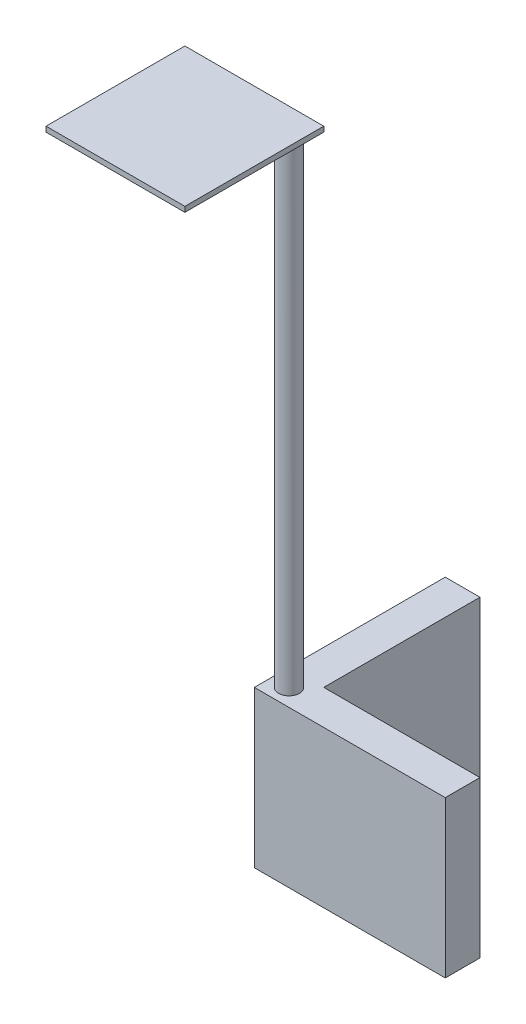
ISO-10303-21;
HEADER;
FILE_DESCRIPTION(('STEP AP214'),'2;1');
FILE_NAME('part.step','',(''),(''),'','','');
FILE_SCHEMA(('AUTOMOTIVE_DESIGN { 1 0 10303 214 1 1 1 1 }'));
ENDSEC;
DATA;
#1=APPLICATION_CONTEXT('core data for automotive mechanical design processes');
#2=APPLICATION_PROTOCOL_DEFINITION('international standard','automotive_design',2000,#1);
#3=PRODUCT_CONTEXT('',#1,'mechanical');
#4=PRODUCT('Part','Part','',(#3));
#5=PRODUCT_RELATED_PRODUCT_CATEGORY('part','',(#4));
#6=PRODUCT_DEFINITION_FORMATION('','',#4);
#7=PRODUCT_DEFINITION_CONTEXT('part definition',#1,'design');
#8=PRODUCT_DEFINITION('design','',#6,#7);
#9=PRODUCT_DEFINITION_SHAPE('','',#8);
#10=(LENGTH_UNIT() NAMED_UNIT(*) SI_UNIT(.MILLI.,.METRE.));
#11=(NAMED_UNIT(*) PLANE_ANGLE_UNIT() SI_UNIT($,.RADIAN.));
#12=(NAMED_UNIT(*) SI_UNIT($,.STERADIAN.) SOLID_ANGLE_UNIT());
#13=UNCERTAINTY_MEASURE_WITH_UNIT(LENGTH_MEASURE(1.E-05),#10,'distance_accuracy_value','');
#14=(GEOMETRIC_REPRESENTATION_CONTEXT(3) GLOBAL_UNCERTAINTY_ASSIGNED_CONTEXT((#13)) GLOBAL_UNIT_ASSIGNED_CONTEXT((#10,
#11,#12)) REPRESENTATION_CONTEXT('',''));
#15=CARTESIAN_POINT('',(0.,0.,0.));
#16=DIRECTION('',(0.,0.,1.));
#17=DIRECTION('',(1.,0.,0.));
#18=AXIS2_PLACEMENT_3D('',#15,#16,#17);
#19=CARTESIAN_POINT('',(20.,32.03596113666,-75.9293033438984));
#20=DIRECTION('',(0.,-1.,0.));
#21=DIRECTION('',(0.,0.,-1.));
#22=AXIS2_PLACEMENT_3D('',#19,#20,#21);
#23=PLANE('',#22);
#24=DIRECTION('',(0.,0.,1.));
#25=VECTOR('',#24,1.);
#26=CARTESIAN_POINT('',(0.,32.03596113666,-75.9293033438984));
#27=LINE('',#26,#25);
#28=CARTESIAN_POINT('',(0.,32.03596113666,-75.9293033438984));
#29=VERTEX_POINT('',#28);
#30=CARTESIAN_POINT('',(0.,32.0359611366599,34.0706966561016));
#31=VERTEX_POINT('',#30);
#32=EDGE_CURVE('E62',#29,#31,#27,.T.);
#33=ORIENTED_EDGE('',*,*,#32,.T.);
#34=DIRECTION('',(-1.,0.,0.));
#35=VECTOR('',#34,1.);
#36=CARTESIAN_POINT('',(0.,32.0359611366599,34.0706966561016));
#37=LINE('',#36,#35);
#38=CARTESIAN_POINT('',(110.,32.0359611366599,34.0706966561016));
#39=VERTEX_POINT('',#38);
#40=EDGE_CURVE('E312',#39,#31,#37,.T.);
#41=ORIENTED_EDGE('',*,*,#40,.F.);
#42=DIRECTION('',(0.,0.,-1.));
#43=VECTOR('',#42,1.);
#44=CARTESIAN_POINT('',(110.,32.0359611366599,34.0706966561016));
#45=LINE('',#44,#43);
#46=CARTESIAN_POINT('',(110.,32.0359611366599,14.0706966561016));
#47=VERTEX_POINT('',#46);
#48=EDGE_CURVE('E315',#39,#47,#45,.T.);
#49=ORIENTED_EDGE('',*,*,#48,.T.);
#50=DIRECTION('',(-1.,0.,0.));
#51=VECTOR('',#50,1.);
#52=CARTESIAN_POINT('',(0.,32.0359611366599,14.0706966561016));
#53=LINE('',#52,#51);
#54=CARTESIAN_POINT('',(20.,32.0359611366599,14.0706966561016));
#55=VERTEX_POINT('',#54);
#56=EDGE_CURVE('E85',#47,#55,#53,.T.);
#57=ORIENTED_EDGE('',*,*,#56,.T.);
#58=DIRECTION('',(0.,0.,1.));
#59=VECTOR('',#58,1.);
#60=CARTESIAN_POINT('',(20.,32.03596113666,-75.9293033438984));
#61=LINE('',#60,#59);
#62=CARTESIAN_POINT('',(20.,32.03596113666,-75.9293033438984));
#63=VERTEX_POINT('',#62);
#64=EDGE_CURVE('E80',#63,#55,#61,.T.);
#65=ORIENTED_EDGE('',*,*,#64,.F.);
#66=DIRECTION('',(-1.,0.,0.));
#67=VECTOR('',#66,1.);
#68=CARTESIAN_POINT('',(20.,32.03596113666,-75.9293033438984));
#69=LINE('',#68,#67);
#70=EDGE_CURVE('E41',#63,#29,#69,.T.);
#71=ORIENTED_EDGE('',*,*,#70,.T.);
#72=EDGE_LOOP('',(#33,#41,#49,#57,#65,#71));
#73=FACE_BOUND('',#72,.T.);
#74=CARTESIAN_POINT('',(10.,32.03596113666,24.0706966561016));
#75=DIRECTION('',(0.,-1.,0.));
#76=DIRECTION('',(0.,0.,-1.));
#77=AXIS2_PLACEMENT_3D('',#74,#75,#76);
#78=CIRCLE('',#77,6.);
#79=CARTESIAN_POINT('',(10.,32.03596113666,18.0706966561016));
#80=VERTEX_POINT('',#79);
#81=EDGE_CURVE('E11',#80,#80,#78,.F.);
#82=ORIENTED_EDGE('',*,*,#81,.F.);
#83=EDGE_LOOP('',(#82));
#84=FACE_BOUND('',#83,.T.);
#85=ADVANCED_FACE('F32',(#73,#84),#23,.F.);
#86=CARTESIAN_POINT('',(20.,32.03596113666,-75.9293033438984));
#87=DIRECTION('',(0.,0.,1.));
#88=DIRECTION('',(0.,-1.,0.));
#89=AXIS2_PLACEMENT_3D('',#86,#87,#88);
#90=PLANE('',#89);
#91=DIRECTION('',(0.,1.,0.));
#92=VECTOR('',#91,1.);
#93=CARTESIAN_POINT('',(0.,32.03596113666,-75.9293033438984));
#94=LINE('',#93,#92);
#95=CARTESIAN_POINT('',(0.,-57.96403886334,-75.9293033438984));
#96=VERTEX_POINT('',#95);
#97=EDGE_CURVE('E94',#96,#29,#94,.T.);
#98=ORIENTED_EDGE('',*,*,#97,.T.);
#99=ORIENTED_EDGE('',*,*,#70,.F.);
#100=DIRECTION('',(0.,1.,0.));
#101=VECTOR('',#100,1.);
#102=CARTESIAN_POINT('',(20.,32.03596113666,-75.9293033438984));
#103=LINE('',#102,#101);
#104=CARTESIAN_POINT('',(20.,-57.96403886334,-75.9293033438984));
#105=VERTEX_POINT('',#104);
#106=EDGE_CURVE('E86',#105,#63,#103,.T.);
#107=ORIENTED_EDGE('',*,*,#106,.F.);
#108=DIRECTION('',(-1.,0.,0.));
#109=VECTOR('',#108,1.);
#110=CARTESIAN_POINT('',(20.,-57.96403886334,-75.9293033438984));
#111=LINE('',#110,#109);
#112=EDGE_CURVE('E95',#105,#96,#111,.T.);
#113=ORIENTED_EDGE('',*,*,#112,.T.);
#114=EDGE_LOOP('',(#98,#99,#107,#113));
#115=FACE_BOUND('',#114,.T.);
#116=ADVANCED_FACE('F34',(#115),#90,.F.);
#117=CARTESIAN_POINT('',(20.,-57.96403886334,-75.9293033438984));
#118=DIRECTION('',(0.,1.,0.));
#119=DIRECTION('',(0.,0.,1.));
#120=AXIS2_PLACEMENT_3D('',#117,#118,#119);
#121=PLANE('',#120);
#122=DIRECTION('',(0.,0.,-1.));
#123=VECTOR('',#122,1.);
#124=CARTESIAN_POINT('',(0.,-57.96403886334,-75.9293033438984));
#125=LINE('',#124,#123);
#126=CARTESIAN_POINT('',(0.,-57.9640388633401,34.0706966561016));
#127=VERTEX_POINT('',#126);
#128=EDGE_CURVE('E92',#127,#96,#125,.T.);
#129=ORIENTED_EDGE('',*,*,#128,.T.);
#130=ORIENTED_EDGE('',*,*,#112,.F.);
#131=DIRECTION('',(0.,0.,-1.));
#132=VECTOR('',#131,1.);
#133=CARTESIAN_POINT('',(20.,-57.96403886334,-75.9293033438984));
#134=LINE('',#133,#132);
#135=CARTESIAN_POINT('',(20.,-57.9640388633401,14.0706966561016));
#136=VERTEX_POINT('',#135);
#137=EDGE_CURVE('E49',#136,#105,#134,.T.);
#138=ORIENTED_EDGE('',*,*,#137,.F.);
#139=DIRECTION('',(1.,0.,0.));
#140=VECTOR('',#139,1.);
#141=CARTESIAN_POINT('',(0.,-57.9640388633401,14.0706966561016));
#142=LINE('',#141,#140);
#143=CARTESIAN_POINT('',(110.,-57.9640388633401,14.0706966561016));
#144=VERTEX_POINT('',#143);
#145=EDGE_CURVE('E305',#136,#144,#142,.T.);
#146=ORIENTED_EDGE('',*,*,#145,.T.);
#147=DIRECTION('',(0.,0.,-1.));
#148=VECTOR('',#147,1.);
#149=CARTESIAN_POINT('',(110.,-57.9640388633401,34.0706966561016));
#150=LINE('',#149,#148);
#151=CARTESIAN_POINT('',(110.,-57.9640388633401,34.0706966561016));
#152=VERTEX_POINT('',#151);
#153=EDGE_CURVE('E107',#152,#144,#150,.T.);
#154=ORIENTED_EDGE('',*,*,#153,.F.);
#155=DIRECTION('',(1.,0.,0.));
#156=VECTOR('',#155,1.);
#157=CARTESIAN_POINT('',(0.,-57.9640388633401,34.0706966561016));
#158=LINE('',#157,#156);
#159=EDGE_CURVE('E115',#127,#152,#158,.T.);
#160=ORIENTED_EDGE('',*,*,#159,.F.);
#161=EDGE_LOOP('',(#129,#130,#138,#146,#154,#160));
#162=FACE_BOUND('',#161,.T.);
#163=ADVANCED_FACE('F111',(#162),#121,.F.);
#164=CARTESIAN_POINT('',(20.,0.,0.));
#165=DIRECTION('',(-1.,0.,0.));
#166=DIRECTION('',(0.,0.,1.));
#167=AXIS2_PLACEMENT_3D('',#164,#165,#166);
#168=PLANE('',#167);
#169=ORIENTED_EDGE('',*,*,#106,.T.);
#170=ORIENTED_EDGE('',*,*,#64,.T.);
#171=DIRECTION('',(0.,-1.,0.));
#172=VECTOR('',#171,1.);
#173=CARTESIAN_POINT('',(20.,32.0359611366599,14.0706966561016));
#174=LINE('',#173,#172);
#175=EDGE_CURVE('E70',#55,#136,#174,.T.);
#176=ORIENTED_EDGE('',*,*,#175,.T.);
#177=ORIENTED_EDGE('',*,*,#137,.T.);
#178=EDGE_LOOP('',(#169,#170,#176,#177));
#179=FACE_BOUND('',#178,.T.);
#180=ADVANCED_FACE('F89',(#179),#168,.F.);
#181=CARTESIAN_POINT('',(0.,0.,0.));
#182=DIRECTION('',(-1.,0.,0.));
#183=DIRECTION('',(0.,0.,1.));
#184=AXIS2_PLACEMENT_3D('',#181,#182,#183);
#185=PLANE('',#184);
#186=ORIENTED_EDGE('',*,*,#97,.F.);
#187=ORIENTED_EDGE('',*,*,#128,.F.);
#188=DIRECTION('',(0.,-1.,0.));
#189=VECTOR('',#188,1.);
#190=CARTESIAN_POINT('',(0.,32.0359611366599,34.0706966561016));
#191=LINE('',#190,#189);
#192=EDGE_CURVE('E306',#31,#127,#191,.T.);
#193=ORIENTED_EDGE('',*,*,#192,.F.);
#194=ORIENTED_EDGE('',*,*,#32,.F.);
#195=EDGE_LOOP('',(#186,#187,#193,#194));
#196=FACE_BOUND('',#195,.T.);
#197=ADVANCED_FACE('F117',(#196),#185,.T.);
#198=CARTESIAN_POINT('',(110.,32.0359611366599,34.0706966561016));
#199=DIRECTION('',(-1.,0.,0.));
#200=DIRECTION('',(0.,-1.,0.));
#201=AXIS2_PLACEMENT_3D('',#198,#199,#200);
#202=PLANE('',#201);
#203=DIRECTION('',(0.,1.,0.));
#204=VECTOR('',#203,1.);
#205=CARTESIAN_POINT('',(110.,32.0359611366599,14.0706966561016));
#206=LINE('',#205,#204);
#207=EDGE_CURVE('E318',#144,#47,#206,.T.);
#208=ORIENTED_EDGE('',*,*,#207,.T.);
#209=ORIENTED_EDGE('',*,*,#48,.F.);
#210=DIRECTION('',(0.,1.,0.));
#211=VECTOR('',#210,1.);
#212=CARTESIAN_POINT('',(110.,32.0359611366599,34.0706966561016));
#213=LINE('',#212,#211);
#214=EDGE_CURVE('E309',#152,#39,#213,.T.);
#215=ORIENTED_EDGE('',*,*,#214,.F.);
#216=ORIENTED_EDGE('',*,*,#153,.T.);
#217=EDGE_LOOP('',(#208,#209,#215,#216));
#218=FACE_BOUND('',#217,.T.);
#219=ADVANCED_FACE('F119',(#218),#202,.F.);
#220=CARTESIAN_POINT('',(0.,0.,34.0706966561016));
#221=DIRECTION('',(0.,0.,1.));
#222=DIRECTION('',(1.,0.,0.));
#223=AXIS2_PLACEMENT_3D('',#220,#221,#222);
#224=PLANE('',#223);
#225=ORIENTED_EDGE('',*,*,#192,.T.);
#226=ORIENTED_EDGE('',*,*,#159,.T.);
#227=ORIENTED_EDGE('',*,*,#214,.T.);
#228=ORIENTED_EDGE('',*,*,#40,.T.);
#229=EDGE_LOOP('',(#225,#226,#227,#228));
#230=FACE_BOUND('',#229,.T.);
#231=ADVANCED_FACE('F125',(#230),#224,.T.);
#232=CARTESIAN_POINT('',(0.,0.,14.0706966561016));
#233=DIRECTION('',(0.,0.,1.));
#234=DIRECTION('',(1.,0.,0.));
#235=AXIS2_PLACEMENT_3D('',#232,#233,#234);
#236=PLANE('',#235);
#237=ORIENTED_EDGE('',*,*,#175,.F.);
#238=ORIENTED_EDGE('',*,*,#56,.F.);
#239=ORIENTED_EDGE('',*,*,#207,.F.);
#240=ORIENTED_EDGE('',*,*,#145,.F.);
#241=EDGE_LOOP('',(#237,#238,#239,#240));
#242=FACE_BOUND('',#241,.T.);
#243=ADVANCED_FACE('F164',(#242),#236,.F.);
#244=CARTESIAN_POINT('',(10.,309.03596113666,24.0706966561016));
#245=DIRECTION('',(0.,-1.,0.));
#246=DIRECTION('',(0.,0.,-1.));
#247=AXIS2_PLACEMENT_3D('',#244,#245,#246);
#248=CYLINDRICAL_SURFACE('',#247,6.);
#249=CARTESIAN_POINT('',(10.,309.03596113666,24.0706966561016));
#250=DIRECTION('',(0.,1.,0.));
#251=DIRECTION('',(0.,0.,1.));
#252=AXIS2_PLACEMENT_3D('',#249,#250,#251);
#253=CIRCLE('',#252,6.);
#254=CARTESIAN_POINT('',(10.,309.03596113666,30.0706966561016));
#255=VERTEX_POINT('',#254);
#256=EDGE_CURVE('E302',#255,#255,#253,.T.);
#257=ORIENTED_EDGE('',*,*,#256,.F.);
#258=EDGE_LOOP('',(#257));
#259=FACE_BOUND('',#258,.T.);
#260=ORIENTED_EDGE('',*,*,#81,.T.);
#261=EDGE_LOOP('',(#260));
#262=FACE_BOUND('',#261,.T.);
#263=ADVANCED_FACE('F173',(#259,#262),#248,.T.);
#264=CARTESIAN_POINT('',(0.,309.03596113666,0.));
#265=DIRECTION('',(0.,-1.,0.));
#266=DIRECTION('',(0.,0.,-1.));
#267=AXIS2_PLACEMENT_3D('',#264,#265,#266);
#268=PLANE('',#267);
#269=DIRECTION('',(0.,0.,1.));
#270=VECTOR('',#269,1.);
#271=CARTESIAN_POINT('',(-60.,309.03596113666,94.0706966561016));
#272=LINE('',#271,#270);
#273=CARTESIAN_POINT('',(-60.,309.03596113666,14.0706966561016));
#274=VERTEX_POINT('',#273);
#275=CARTESIAN_POINT('',(-60.,309.03596113666,94.0706966561016));
#276=VERTEX_POINT('',#275);
#277=EDGE_CURVE('E279',#274,#276,#272,.T.);
#278=ORIENTED_EDGE('',*,*,#277,.F.);
#279=DIRECTION('',(-1.,0.,0.));
#280=VECTOR('',#279,1.);
#281=CARTESIAN_POINT('',(-60.,309.03596113666,14.0706966561016));
#282=LINE('',#281,#280);
#283=CARTESIAN_POINT('',(20.,309.03596113666,14.0706966561016));
#284=VERTEX_POINT('',#283);
#285=EDGE_CURVE('E288',#284,#274,#282,.T.);
#286=ORIENTED_EDGE('',*,*,#285,.F.);
#287=DIRECTION('',(0.,0.,-1.));
#288=VECTOR('',#287,1.);
#289=CARTESIAN_POINT('',(20.,309.03596113666,94.0706966561016));
#290=LINE('',#289,#288);
#291=CARTESIAN_POINT('',(20.,309.03596113666,94.0706966561016));
#292=VERTEX_POINT('',#291);
#293=EDGE_CURVE('E285',#292,#284,#290,.T.);
#294=ORIENTED_EDGE('',*,*,#293,.F.);
#295=DIRECTION('',(1.,0.,0.));
#296=VECTOR('',#295,1.);
#297=CARTESIAN_POINT('',(-60.,309.03596113666,94.0706966561016));
#298=LINE('',#297,#296);
#299=EDGE_CURVE('E282',#276,#292,#298,.T.);
#300=ORIENTED_EDGE('',*,*,#299,.F.);
#301=EDGE_LOOP('',(#278,#286,#294,#300));
#302=FACE_BOUND('',#301,.T.);
#303=ORIENTED_EDGE('',*,*,#256,.T.);
#304=EDGE_LOOP('',(#303));
#305=FACE_BOUND('',#304,.T.);
#306=ADVANCED_FACE('F188',(#302,#305),#268,.T.);
#307=CARTESIAN_POINT('',(-60.,311.93596113666,94.0706966561016));
#308=DIRECTION('',(1.,0.,0.));
#309=DIRECTION('',(0.,0.,-1.));
#310=AXIS2_PLACEMENT_3D('',#307,#308,#309);
#311=PLANE('',#310);
#312=ORIENTED_EDGE('',*,*,#277,.T.);
#313=DIRECTION('',(0.,-1.,0.));
#314=VECTOR('',#313,1.);
#315=CARTESIAN_POINT('',(-60.,311.93596113666,94.0706966561016));
#316=LINE('',#315,#314);
#317=CARTESIAN_POINT('',(-60.,312.03596113666,94.0706966561016));
#318=VERTEX_POINT('',#317);
#319=EDGE_CURVE('E299',#318,#276,#316,.T.);
#320=ORIENTED_EDGE('',*,*,#319,.F.);
#321=DIRECTION('',(0.,0.,1.));
#322=VECTOR('',#321,1.);
#323=CARTESIAN_POINT('',(-60.,312.03596113666,14.0706966561016));
#324=LINE('',#323,#322);
#325=CARTESIAN_POINT('',(-60.,312.03596113666,14.0706966561016));
#326=VERTEX_POINT('',#325);
#327=EDGE_CURVE('E261',#326,#318,#324,.T.);
#328=ORIENTED_EDGE('',*,*,#327,.F.);
#329=DIRECTION('',(0.,-1.,0.));
#330=VECTOR('',#329,1.);
#331=CARTESIAN_POINT('',(-60.,311.93596113666,14.0706966561016));
#332=LINE('',#331,#330);
#333=EDGE_CURVE('E291',#326,#274,#332,.T.);
#334=ORIENTED_EDGE('',*,*,#333,.T.);
#335=EDGE_LOOP('',(#312,#320,#328,#334));
#336=FACE_BOUND('',#335,.T.);
#337=ADVANCED_FACE('F198',(#336),#311,.F.);
#338=CARTESIAN_POINT('',(-60.,311.93596113666,94.0706966561016));
#339=DIRECTION('',(0.,0.,-1.));
#340=DIRECTION('',(0.,1.,0.));
#341=AXIS2_PLACEMENT_3D('',#338,#339,#340);
#342=PLANE('',#341);
#343=ORIENTED_EDGE('',*,*,#299,.T.);
#344=DIRECTION('',(0.,-1.,0.));
#345=VECTOR('',#344,1.);
#346=CARTESIAN_POINT('',(20.,311.93596113666,94.0706966561016));
#347=LINE('',#346,#345);
#348=CARTESIAN_POINT('',(20.,312.03596113666,94.0706966561016));
#349=VERTEX_POINT('',#348);
#350=EDGE_CURVE('E296',#349,#292,#347,.T.);
#351=ORIENTED_EDGE('',*,*,#350,.F.);
#352=DIRECTION('',(1.,0.,0.));
#353=VECTOR('',#352,1.);
#354=CARTESIAN_POINT('',(-60.,312.03596113666,94.0706966561016));
#355=LINE('',#354,#353);
#356=EDGE_CURVE('E265',#318,#349,#355,.T.);
#357=ORIENTED_EDGE('',*,*,#356,.F.);
#358=ORIENTED_EDGE('',*,*,#319,.T.);
#359=EDGE_LOOP('',(#343,#351,#357,#358));
#360=FACE_BOUND('',#359,.T.);
#361=ADVANCED_FACE('F209',(#360),#342,.F.);
#362=CARTESIAN_POINT('',(20.,311.93596113666,94.0706966561016));
#363=DIRECTION('',(-1.,0.,0.));
#364=DIRECTION('',(0.,0.,1.));
#365=AXIS2_PLACEMENT_3D('',#362,#363,#364);
#366=PLANE('',#365);
#367=ORIENTED_EDGE('',*,*,#293,.T.);
#368=DIRECTION('',(0.,-1.,0.));
#369=VECTOR('',#368,1.);
#370=CARTESIAN_POINT('',(20.,311.93596113666,14.0706966561016));
#371=LINE('',#370,#369);
#372=CARTESIAN_POINT('',(20.,312.03596113666,14.0706966561016));
#373=VERTEX_POINT('',#372);
#374=EDGE_CURVE('E293',#373,#284,#371,.T.);
#375=ORIENTED_EDGE('',*,*,#374,.F.);
#376=DIRECTION('',(0.,0.,-1.));
#377=VECTOR('',#376,1.);
#378=CARTESIAN_POINT('',(20.,312.03596113666,14.0706966561016));
#379=LINE('',#378,#377);
#380=EDGE_CURVE('E274',#349,#373,#379,.T.);
#381=ORIENTED_EDGE('',*,*,#380,.F.);
#382=ORIENTED_EDGE('',*,*,#350,.T.);
#383=EDGE_LOOP('',(#367,#375,#381,#382));
#384=FACE_BOUND('',#383,.T.);
#385=ADVANCED_FACE('F220',(#384),#366,.F.);
#386=CARTESIAN_POINT('',(-60.,311.93596113666,14.0706966561016));
#387=DIRECTION('',(0.,0.,1.));
#388=DIRECTION('',(0.,-1.,0.));
#389=AXIS2_PLACEMENT_3D('',#386,#387,#388);
#390=PLANE('',#389);
#391=ORIENTED_EDGE('',*,*,#285,.T.);
#392=ORIENTED_EDGE('',*,*,#333,.F.);
#393=DIRECTION('',(-1.,0.,0.));
#394=VECTOR('',#393,1.);
#395=CARTESIAN_POINT('',(-60.,312.03596113666,14.0706966561016));
#396=LINE('',#395,#394);
#397=EDGE_CURVE('E269',#373,#326,#396,.T.);
#398=ORIENTED_EDGE('',*,*,#397,.F.);
#399=ORIENTED_EDGE('',*,*,#374,.T.);
#400=EDGE_LOOP('',(#391,#392,#398,#399));
#401=FACE_BOUND('',#400,.T.);
#402=ADVANCED_FACE('F231',(#401),#390,.F.);
#403=CARTESIAN_POINT('',(0.,312.03596113666,0.));
#404=DIRECTION('',(0.,1.,0.));
#405=DIRECTION('',(0.,0.,1.));
#406=AXIS2_PLACEMENT_3D('',#403,#404,#405);
#407=PLANE('',#406);
#408=ORIENTED_EDGE('',*,*,#327,.T.);
#409=ORIENTED_EDGE('',*,*,#356,.T.);
#410=ORIENTED_EDGE('',*,*,#380,.T.);
#411=ORIENTED_EDGE('',*,*,#397,.T.);
#412=EDGE_LOOP('',(#408,#409,#410,#411));
#413=FACE_BOUND('',#412,.T.);
#414=ADVANCED_FACE('F242',(#413),#407,.T.);
#415=CLOSED_SHELL('',(#85,#116,#163,#180,#197,#219,#231,#243,#263,#306,#337,#361,#385,#402,#414));
#416=MANIFOLD_SOLID_BREP('B2',#415);
#417=ADVANCED_BREP_SHAPE_REPRESENTATION('',(#18,#416),#14);
#418=SHAPE_DEFINITION_REPRESENTATION(#9,#417);
ENDSEC;
END-ISO-10303-21;
